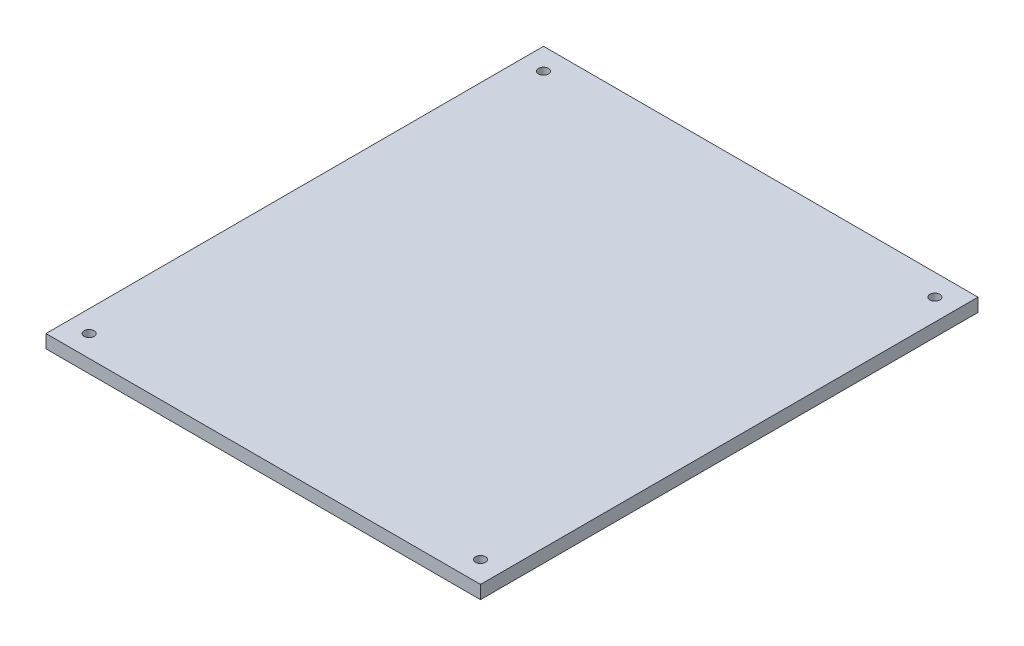
ISO-10303-21;
HEADER;
FILE_DESCRIPTION(('STEP AP214'),'2;1');
FILE_NAME('part.step','',(''),(''),'','','');
FILE_SCHEMA(('AUTOMOTIVE_DESIGN { 1 0 10303 214 1 1 1 1 }'));
ENDSEC;
DATA;
#1=APPLICATION_CONTEXT('core data for automotive mechanical design processes');
#2=APPLICATION_PROTOCOL_DEFINITION('international standard','automotive_design',2000,#1);
#3=PRODUCT_CONTEXT('',#1,'mechanical');
#4=PRODUCT('Part','Part','',(#3));
#5=PRODUCT_RELATED_PRODUCT_CATEGORY('part','',(#4));
#6=PRODUCT_DEFINITION_FORMATION('','',#4);
#7=PRODUCT_DEFINITION_CONTEXT('part definition',#1,'design');
#8=PRODUCT_DEFINITION('design','',#6,#7);
#9=PRODUCT_DEFINITION_SHAPE('','',#8);
#10=(LENGTH_UNIT() NAMED_UNIT(*) SI_UNIT(.MILLI.,.METRE.));
#11=(NAMED_UNIT(*) PLANE_ANGLE_UNIT() SI_UNIT($,.RADIAN.));
#12=(NAMED_UNIT(*) SI_UNIT($,.STERADIAN.) SOLID_ANGLE_UNIT());
#13=UNCERTAINTY_MEASURE_WITH_UNIT(LENGTH_MEASURE(1.E-05),#10,'distance_accuracy_value','');
#14=(GEOMETRIC_REPRESENTATION_CONTEXT(3) GLOBAL_UNCERTAINTY_ASSIGNED_CONTEXT((#13)) GLOBAL_UNIT_ASSIGNED_CONTEXT((#10,
#11,#12)) REPRESENTATION_CONTEXT('',''));
#15=CARTESIAN_POINT('',(0.,0.,0.));
#16=DIRECTION('',(0.,0.,1.));
#17=DIRECTION('',(1.,0.,0.));
#18=AXIS2_PLACEMENT_3D('',#15,#16,#17);
#19=CARTESIAN_POINT('',(0.,4.,0.));
#20=DIRECTION('',(0.,1.,0.));
#21=DIRECTION('',(0.,0.,1.));
#22=AXIS2_PLACEMENT_3D('',#19,#20,#21);
#23=PLANE('',#22);
#24=CARTESIAN_POINT('',(59.,4.,68.5));
#25=DIRECTION('',(0.,1.,0.));
#26=DIRECTION('',(0.,0.,1.));
#27=AXIS2_PLACEMENT_3D('',#24,#25,#26);
#28=CIRCLE('',#27,1.5);
#29=CARTESIAN_POINT('',(59.,4.,70.));
#30=VERTEX_POINT('',#29);
#31=EDGE_CURVE('E121',#30,#30,#28,.T.);
#32=ORIENTED_EDGE('',*,*,#31,.F.);
#33=EDGE_LOOP('',(#32));
#34=FACE_BOUND('',#33,.T.);
#35=CARTESIAN_POINT('',(-59.,4.,-68.5));
#36=DIRECTION('',(0.,1.,0.));
#37=DIRECTION('',(0.,0.,1.));
#38=AXIS2_PLACEMENT_3D('',#35,#36,#37);
#39=CIRCLE('',#38,1.5);
#40=CARTESIAN_POINT('',(-59.,4.,-67.));
#41=VERTEX_POINT('',#40);
#42=EDGE_CURVE('E100',#41,#41,#39,.T.);
#43=ORIENTED_EDGE('',*,*,#42,.F.);
#44=EDGE_LOOP('',(#43));
#45=FACE_BOUND('',#44,.T.);
#46=DIRECTION('',(0.,0.,1.));
#47=VECTOR('',#46,1.);
#48=CARTESIAN_POINT('',(-65.5,4.,-75.));
#49=LINE('',#48,#47);
#50=CARTESIAN_POINT('',(-65.5,4.,-75.));
#51=VERTEX_POINT('',#50);
#52=CARTESIAN_POINT('',(-65.5,4.,75.));
#53=VERTEX_POINT('',#52);
#54=EDGE_CURVE('E85',#51,#53,#49,.T.);
#55=ORIENTED_EDGE('',*,*,#54,.T.);
#56=DIRECTION('',(1.,0.,0.));
#57=VECTOR('',#56,1.);
#58=CARTESIAN_POINT('',(-65.5,4.,75.));
#59=LINE('',#58,#57);
#60=CARTESIAN_POINT('',(65.5,4.,75.));
#61=VERTEX_POINT('',#60);
#62=EDGE_CURVE('E80',#53,#61,#59,.T.);
#63=ORIENTED_EDGE('',*,*,#62,.T.);
#64=DIRECTION('',(0.,0.,-1.));
#65=VECTOR('',#64,1.);
#66=CARTESIAN_POINT('',(65.5,4.,-75.));
#67=LINE('',#66,#65);
#68=CARTESIAN_POINT('',(65.5,4.,-75.));
#69=VERTEX_POINT('',#68);
#70=EDGE_CURVE('E83',#61,#69,#67,.T.);
#71=ORIENTED_EDGE('',*,*,#70,.T.);
#72=DIRECTION('',(-1.,0.,0.));
#73=VECTOR('',#72,1.);
#74=CARTESIAN_POINT('',(-65.5,4.,-75.));
#75=LINE('',#74,#73);
#76=EDGE_CURVE('E50',#69,#51,#75,.T.);
#77=ORIENTED_EDGE('',*,*,#76,.T.);
#78=EDGE_LOOP('',(#55,#63,#71,#77));
#79=FACE_BOUND('',#78,.T.);
#80=CARTESIAN_POINT('',(59.,4.,-68.5));
#81=DIRECTION('',(0.,1.,0.));
#82=DIRECTION('',(0.,0.,-1.));
#83=AXIS2_PLACEMENT_3D('',#80,#81,#82);
#84=CIRCLE('',#83,1.5);
#85=CARTESIAN_POINT('',(59.,4.,-70.));
#86=VERTEX_POINT('',#85);
#87=EDGE_CURVE('E115',#86,#86,#84,.T.);
#88=ORIENTED_EDGE('',*,*,#87,.F.);
#89=EDGE_LOOP('',(#88));
#90=FACE_BOUND('',#89,.T.);
#91=CARTESIAN_POINT('',(-59.,4.,68.5));
#92=DIRECTION('',(0.,1.,0.));
#93=DIRECTION('',(0.,0.,-1.));
#94=AXIS2_PLACEMENT_3D('',#91,#92,#93);
#95=CIRCLE('',#94,1.5);
#96=CARTESIAN_POINT('',(-59.,4.,67.));
#97=VERTEX_POINT('',#96);
#98=EDGE_CURVE('E127',#97,#97,#95,.T.);
#99=ORIENTED_EDGE('',*,*,#98,.F.);
#100=EDGE_LOOP('',(#99));
#101=FACE_BOUND('',#100,.T.);
#102=ADVANCED_FACE('F33',(#34,#45,#79,#90,#101),#23,.T.);
#103=CARTESIAN_POINT('',(0.,0.,0.));
#104=DIRECTION('',(0.,1.,0.));
#105=DIRECTION('',(0.,0.,1.));
#106=AXIS2_PLACEMENT_3D('',#103,#104,#105);
#107=PLANE('',#106);
#108=DIRECTION('',(0.,0.,1.));
#109=VECTOR('',#108,1.);
#110=CARTESIAN_POINT('',(-65.5,0.,-75.));
#111=LINE('',#110,#109);
#112=CARTESIAN_POINT('',(-65.5,0.,-75.));
#113=VERTEX_POINT('',#112);
#114=CARTESIAN_POINT('',(-65.5,0.,75.));
#115=VERTEX_POINT('',#114);
#116=EDGE_CURVE('E97',#113,#115,#111,.T.);
#117=ORIENTED_EDGE('',*,*,#116,.F.);
#118=DIRECTION('',(-1.,0.,0.));
#119=VECTOR('',#118,1.);
#120=CARTESIAN_POINT('',(-65.5,0.,-75.));
#121=LINE('',#120,#119);
#122=CARTESIAN_POINT('',(65.5,0.,-75.));
#123=VERTEX_POINT('',#122);
#124=EDGE_CURVE('E73',#123,#113,#121,.T.);
#125=ORIENTED_EDGE('',*,*,#124,.F.);
#126=DIRECTION('',(0.,0.,-1.));
#127=VECTOR('',#126,1.);
#128=CARTESIAN_POINT('',(65.5,0.,-75.));
#129=LINE('',#128,#127);
#130=CARTESIAN_POINT('',(65.5,0.,75.));
#131=VERTEX_POINT('',#130);
#132=EDGE_CURVE('E67',#131,#123,#129,.T.);
#133=ORIENTED_EDGE('',*,*,#132,.F.);
#134=DIRECTION('',(1.,0.,0.));
#135=VECTOR('',#134,1.);
#136=CARTESIAN_POINT('',(-65.5,0.,75.));
#137=LINE('',#136,#135);
#138=EDGE_CURVE('E89',#115,#131,#137,.T.);
#139=ORIENTED_EDGE('',*,*,#138,.F.);
#140=EDGE_LOOP('',(#117,#125,#133,#139));
#141=FACE_BOUND('',#140,.T.);
#142=CARTESIAN_POINT('',(-59.,0.,-68.5));
#143=DIRECTION('',(0.,1.,0.));
#144=DIRECTION('',(0.,0.,1.));
#145=AXIS2_PLACEMENT_3D('',#142,#143,#144);
#146=CIRCLE('',#145,1.5);
#147=CARTESIAN_POINT('',(-59.,0.,-67.));
#148=VERTEX_POINT('',#147);
#149=EDGE_CURVE('E112',#148,#148,#146,.T.);
#150=ORIENTED_EDGE('',*,*,#149,.T.);
#151=EDGE_LOOP('',(#150));
#152=FACE_BOUND('',#151,.T.);
#153=CARTESIAN_POINT('',(59.,0.,-68.5));
#154=DIRECTION('',(0.,1.,0.));
#155=DIRECTION('',(0.,0.,-1.));
#156=AXIS2_PLACEMENT_3D('',#153,#154,#155);
#157=CIRCLE('',#156,1.5);
#158=CARTESIAN_POINT('',(59.,0.,-70.));
#159=VERTEX_POINT('',#158);
#160=EDGE_CURVE('E118',#159,#159,#157,.T.);
#161=ORIENTED_EDGE('',*,*,#160,.T.);
#162=EDGE_LOOP('',(#161));
#163=FACE_BOUND('',#162,.T.);
#164=CARTESIAN_POINT('',(59.,0.,68.5));
#165=DIRECTION('',(0.,1.,0.));
#166=DIRECTION('',(0.,0.,1.));
#167=AXIS2_PLACEMENT_3D('',#164,#165,#166);
#168=CIRCLE('',#167,1.5);
#169=CARTESIAN_POINT('',(59.,0.,70.));
#170=VERTEX_POINT('',#169);
#171=EDGE_CURVE('E124',#170,#170,#168,.T.);
#172=ORIENTED_EDGE('',*,*,#171,.T.);
#173=EDGE_LOOP('',(#172));
#174=FACE_BOUND('',#173,.T.);
#175=CARTESIAN_POINT('',(-59.,0.,68.5));
#176=DIRECTION('',(0.,1.,0.));
#177=DIRECTION('',(0.,0.,-1.));
#178=AXIS2_PLACEMENT_3D('',#175,#176,#177);
#179=CIRCLE('',#178,1.5);
#180=CARTESIAN_POINT('',(-59.,0.,67.));
#181=VERTEX_POINT('',#180);
#182=EDGE_CURVE('E130',#181,#181,#179,.T.);
#183=ORIENTED_EDGE('',*,*,#182,.T.);
#184=EDGE_LOOP('',(#183));
#185=FACE_BOUND('',#184,.T.);
#186=ADVANCED_FACE('F108',(#141,#152,#163,#174,#185),#107,.F.);
#187=CARTESIAN_POINT('',(-65.5,4.,-75.));
#188=DIRECTION('',(1.,0.,0.));
#189=DIRECTION('',(0.,0.,-1.));
#190=AXIS2_PLACEMENT_3D('',#187,#188,#189);
#191=PLANE('',#190);
#192=ORIENTED_EDGE('',*,*,#116,.T.);
#193=DIRECTION('',(0.,-1.,0.));
#194=VECTOR('',#193,1.);
#195=CARTESIAN_POINT('',(-65.5,4.,75.));
#196=LINE('',#195,#194);
#197=EDGE_CURVE('E11',#53,#115,#196,.T.);
#198=ORIENTED_EDGE('',*,*,#197,.F.);
#199=ORIENTED_EDGE('',*,*,#54,.F.);
#200=DIRECTION('',(0.,-1.,0.));
#201=VECTOR('',#200,1.);
#202=CARTESIAN_POINT('',(-65.5,4.,-75.));
#203=LINE('',#202,#201);
#204=EDGE_CURVE('E93',#51,#113,#203,.T.);
#205=ORIENTED_EDGE('',*,*,#204,.T.);
#206=EDGE_LOOP('',(#192,#198,#199,#205));
#207=FACE_BOUND('',#206,.T.);
#208=ADVANCED_FACE('F35',(#207),#191,.F.);
#209=CARTESIAN_POINT('',(-65.5,4.,75.));
#210=DIRECTION('',(0.,0.,-1.));
#211=DIRECTION('',(-1.,0.,0.));
#212=AXIS2_PLACEMENT_3D('',#209,#210,#211);
#213=PLANE('',#212);
#214=ORIENTED_EDGE('',*,*,#138,.T.);
#215=DIRECTION('',(0.,-1.,0.));
#216=VECTOR('',#215,1.);
#217=CARTESIAN_POINT('',(65.5,4.,75.));
#218=LINE('',#217,#216);
#219=EDGE_CURVE('E42',#61,#131,#218,.T.);
#220=ORIENTED_EDGE('',*,*,#219,.F.);
#221=ORIENTED_EDGE('',*,*,#62,.F.);
#222=ORIENTED_EDGE('',*,*,#197,.T.);
#223=EDGE_LOOP('',(#214,#220,#221,#222));
#224=FACE_BOUND('',#223,.T.);
#225=ADVANCED_FACE('F88',(#224),#213,.F.);
#226=CARTESIAN_POINT('',(65.5,4.,-75.));
#227=DIRECTION('',(-1.,0.,0.));
#228=DIRECTION('',(0.,0.,1.));
#229=AXIS2_PLACEMENT_3D('',#226,#227,#228);
#230=PLANE('',#229);
#231=ORIENTED_EDGE('',*,*,#132,.T.);
#232=DIRECTION('',(0.,-1.,0.));
#233=VECTOR('',#232,1.);
#234=CARTESIAN_POINT('',(65.5,4.,-75.));
#235=LINE('',#234,#233);
#236=EDGE_CURVE('E90',#69,#123,#235,.T.);
#237=ORIENTED_EDGE('',*,*,#236,.F.);
#238=ORIENTED_EDGE('',*,*,#70,.F.);
#239=ORIENTED_EDGE('',*,*,#219,.T.);
#240=EDGE_LOOP('',(#231,#237,#238,#239));
#241=FACE_BOUND('',#240,.T.);
#242=ADVANCED_FACE('F91',(#241),#230,.F.);
#243=CARTESIAN_POINT('',(-65.5,4.,-75.));
#244=DIRECTION('',(0.,0.,1.));
#245=DIRECTION('',(1.,0.,0.));
#246=AXIS2_PLACEMENT_3D('',#243,#244,#245);
#247=PLANE('',#246);
#248=ORIENTED_EDGE('',*,*,#124,.T.);
#249=ORIENTED_EDGE('',*,*,#204,.F.);
#250=ORIENTED_EDGE('',*,*,#76,.F.);
#251=ORIENTED_EDGE('',*,*,#236,.T.);
#252=EDGE_LOOP('',(#248,#249,#250,#251));
#253=FACE_BOUND('',#252,.T.);
#254=ADVANCED_FACE('F105',(#253),#247,.F.);
#255=CARTESIAN_POINT('',(-59.,4.,-68.5));
#256=DIRECTION('',(0.,-1.,0.));
#257=DIRECTION('',(0.,0.,-1.));
#258=AXIS2_PLACEMENT_3D('',#255,#256,#257);
#259=CYLINDRICAL_SURFACE('',#258,1.5);
#260=ORIENTED_EDGE('',*,*,#42,.T.);
#261=EDGE_LOOP('',(#260));
#262=FACE_BOUND('',#261,.T.);
#263=ORIENTED_EDGE('',*,*,#149,.F.);
#264=EDGE_LOOP('',(#263));
#265=FACE_BOUND('',#264,.T.);
#266=ADVANCED_FACE('F149',(#262,#265),#259,.F.);
#267=CARTESIAN_POINT('',(59.,4.,-68.5));
#268=DIRECTION('',(0.,-1.,0.));
#269=DIRECTION('',(0.,0.,-1.));
#270=AXIS2_PLACEMENT_3D('',#267,#268,#269);
#271=CYLINDRICAL_SURFACE('',#270,1.5);
#272=ORIENTED_EDGE('',*,*,#87,.T.);
#273=EDGE_LOOP('',(#272));
#274=FACE_BOUND('',#273,.T.);
#275=ORIENTED_EDGE('',*,*,#160,.F.);
#276=EDGE_LOOP('',(#275));
#277=FACE_BOUND('',#276,.T.);
#278=ADVANCED_FACE('F195',(#274,#277),#271,.F.);
#279=CARTESIAN_POINT('',(59.,4.,68.5));
#280=DIRECTION('',(0.,-1.,0.));
#281=DIRECTION('',(0.,0.,-1.));
#282=AXIS2_PLACEMENT_3D('',#279,#280,#281);
#283=CYLINDRICAL_SURFACE('',#282,1.5);
#284=ORIENTED_EDGE('',*,*,#31,.T.);
#285=EDGE_LOOP('',(#284));
#286=FACE_BOUND('',#285,.T.);
#287=ORIENTED_EDGE('',*,*,#171,.F.);
#288=EDGE_LOOP('',(#287));
#289=FACE_BOUND('',#288,.T.);
#290=ADVANCED_FACE('F203',(#286,#289),#283,.F.);
#291=CARTESIAN_POINT('',(-59.,4.,68.5));
#292=DIRECTION('',(0.,-1.,0.));
#293=DIRECTION('',(0.,0.,-1.));
#294=AXIS2_PLACEMENT_3D('',#291,#292,#293);
#295=CYLINDRICAL_SURFACE('',#294,1.5);
#296=ORIENTED_EDGE('',*,*,#98,.T.);
#297=EDGE_LOOP('',(#296));
#298=FACE_BOUND('',#297,.T.);
#299=ORIENTED_EDGE('',*,*,#182,.F.);
#300=EDGE_LOOP('',(#299));
#301=FACE_BOUND('',#300,.T.);
#302=ADVANCED_FACE('F136',(#298,#301),#295,.F.);
#303=CLOSED_SHELL('',(#102,#186,#208,#225,#242,#254,#266,#278,#290,#302));
#304=MANIFOLD_SOLID_BREP('B2',#303);
#305=ADVANCED_BREP_SHAPE_REPRESENTATION('',(#18,#304),#14);
#306=SHAPE_DEFINITION_REPRESENTATION(#9,#305);
ENDSEC;
END-ISO-10303-21;
